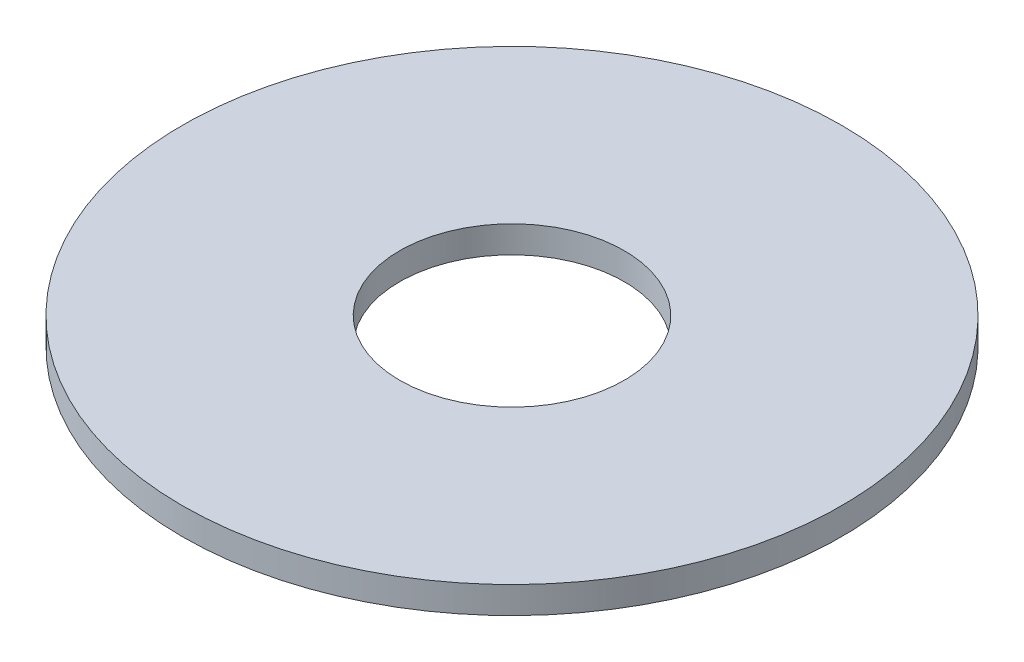
ISO-10303-21;
HEADER;
FILE_DESCRIPTION(('STEP AP214'),'2;1');
FILE_NAME('part.step','',(''),(''),'','','');
FILE_SCHEMA(('AUTOMOTIVE_DESIGN { 1 0 10303 214 1 1 1 1 }'));
ENDSEC;
DATA;
#1=APPLICATION_CONTEXT('core data for automotive mechanical design processes');
#2=APPLICATION_PROTOCOL_DEFINITION('international standard','automotive_design',2000,#1);
#3=PRODUCT_CONTEXT('',#1,'mechanical');
#4=PRODUCT('Part','Part','',(#3));
#5=PRODUCT_RELATED_PRODUCT_CATEGORY('part','',(#4));
#6=PRODUCT_DEFINITION_FORMATION('','',#4);
#7=PRODUCT_DEFINITION_CONTEXT('part definition',#1,'design');
#8=PRODUCT_DEFINITION('design','',#6,#7);
#9=PRODUCT_DEFINITION_SHAPE('','',#8);
#10=(LENGTH_UNIT() NAMED_UNIT(*) SI_UNIT(.MILLI.,.METRE.));
#11=(NAMED_UNIT(*) PLANE_ANGLE_UNIT() SI_UNIT($,.RADIAN.));
#12=(NAMED_UNIT(*) SI_UNIT($,.STERADIAN.) SOLID_ANGLE_UNIT());
#13=UNCERTAINTY_MEASURE_WITH_UNIT(LENGTH_MEASURE(1.E-05),#10,'distance_accuracy_value','');
#14=(GEOMETRIC_REPRESENTATION_CONTEXT(3) GLOBAL_UNCERTAINTY_ASSIGNED_CONTEXT((#13)) GLOBAL_UNIT_ASSIGNED_CONTEXT((#10,
#11,#12)) REPRESENTATION_CONTEXT('',''));
#15=CARTESIAN_POINT('',(0.,0.,0.));
#16=DIRECTION('',(0.,0.,1.));
#17=DIRECTION('',(1.,0.,0.));
#18=AXIS2_PLACEMENT_3D('',#15,#16,#17);
#19=CARTESIAN_POINT('',(0.,4.,0.));
#20=DIRECTION('',(0.,1.,0.));
#21=DIRECTION('',(0.,0.,1.));
#22=AXIS2_PLACEMENT_3D('',#19,#20,#21);
#23=PLANE('',#22);
#24=CARTESIAN_POINT('',(0.,4.,0.));
#25=DIRECTION('',(0.,1.,0.));
#26=DIRECTION('',(0.,0.,1.));
#27=AXIS2_PLACEMENT_3D('',#24,#25,#26);
#28=CIRCLE('',#27,49.);
#29=CARTESIAN_POINT('',(0.,4.,49.));
#30=VERTEX_POINT('',#29);
#31=EDGE_CURVE('E10',#30,#30,#28,.T.);
#32=ORIENTED_EDGE('',*,*,#31,.T.);
#33=EDGE_LOOP('',(#32));
#34=FACE_BOUND('',#33,.T.);
#35=CARTESIAN_POINT('',(0.,4.,0.));
#36=DIRECTION('',(0.,1.,0.));
#37=DIRECTION('',(0.,0.,1.));
#38=AXIS2_PLACEMENT_3D('',#35,#36,#37);
#39=CIRCLE('',#38,16.7);
#40=CARTESIAN_POINT('',(0.,4.,16.7));
#41=VERTEX_POINT('',#40);
#42=EDGE_CURVE('E46',#41,#41,#39,.T.);
#43=ORIENTED_EDGE('',*,*,#42,.F.);
#44=EDGE_LOOP('',(#43));
#45=FACE_BOUND('',#44,.T.);
#46=ADVANCED_FACE('F35',(#34,#45),#23,.T.);
#47=CARTESIAN_POINT('',(0.,0.,0.));
#48=DIRECTION('',(0.,1.,0.));
#49=DIRECTION('',(0.,0.,1.));
#50=AXIS2_PLACEMENT_3D('',#47,#48,#49);
#51=PLANE('',#50);
#52=CARTESIAN_POINT('',(0.,0.,0.));
#53=DIRECTION('',(0.,1.,0.));
#54=DIRECTION('',(0.,0.,1.));
#55=AXIS2_PLACEMENT_3D('',#52,#53,#54);
#56=CIRCLE('',#55,49.);
#57=CARTESIAN_POINT('',(0.,0.,49.));
#58=VERTEX_POINT('',#57);
#59=EDGE_CURVE('E39',#58,#58,#56,.T.);
#60=ORIENTED_EDGE('',*,*,#59,.F.);
#61=EDGE_LOOP('',(#60));
#62=FACE_BOUND('',#61,.T.);
#63=CARTESIAN_POINT('',(0.,0.,0.));
#64=DIRECTION('',(0.,1.,0.));
#65=DIRECTION('',(0.,0.,1.));
#66=AXIS2_PLACEMENT_3D('',#63,#64,#65);
#67=CIRCLE('',#66,16.7);
#68=CARTESIAN_POINT('',(0.,0.,16.7));
#69=VERTEX_POINT('',#68);
#70=EDGE_CURVE('E48',#69,#69,#67,.T.);
#71=ORIENTED_EDGE('',*,*,#70,.T.);
#72=EDGE_LOOP('',(#71));
#73=FACE_BOUND('',#72,.T.);
#74=ADVANCED_FACE('F58',(#62,#73),#51,.F.);
#75=CARTESIAN_POINT('',(0.,4.,0.));
#76=DIRECTION('',(0.,-1.,0.));
#77=DIRECTION('',(0.,0.,-1.));
#78=AXIS2_PLACEMENT_3D('',#75,#76,#77);
#79=CYLINDRICAL_SURFACE('',#78,49.);
#80=ORIENTED_EDGE('',*,*,#31,.F.);
#81=EDGE_LOOP('',(#80));
#82=FACE_BOUND('',#81,.T.);
#83=ORIENTED_EDGE('',*,*,#59,.T.);
#84=EDGE_LOOP('',(#83));
#85=FACE_BOUND('',#84,.T.);
#86=ADVANCED_FACE('F37',(#82,#85),#79,.T.);
#87=CARTESIAN_POINT('',(0.,4.,0.));
#88=DIRECTION('',(0.,-1.,0.));
#89=DIRECTION('',(0.,0.,-1.));
#90=AXIS2_PLACEMENT_3D('',#87,#88,#89);
#91=CYLINDRICAL_SURFACE('',#90,16.7);
#92=ORIENTED_EDGE('',*,*,#42,.T.);
#93=EDGE_LOOP('',(#92));
#94=FACE_BOUND('',#93,.T.);
#95=ORIENTED_EDGE('',*,*,#70,.F.);
#96=EDGE_LOOP('',(#95));
#97=FACE_BOUND('',#96,.T.);
#98=ADVANCED_FACE('F54',(#94,#97),#91,.F.);
#99=CLOSED_SHELL('',(#46,#74,#86,#98));
#100=MANIFOLD_SOLID_BREP('B2',#99);
#101=ADVANCED_BREP_SHAPE_REPRESENTATION('',(#18,#100),#14);
#102=SHAPE_DEFINITION_REPRESENTATION(#9,#101);
ENDSEC;
END-ISO-10303-21;
